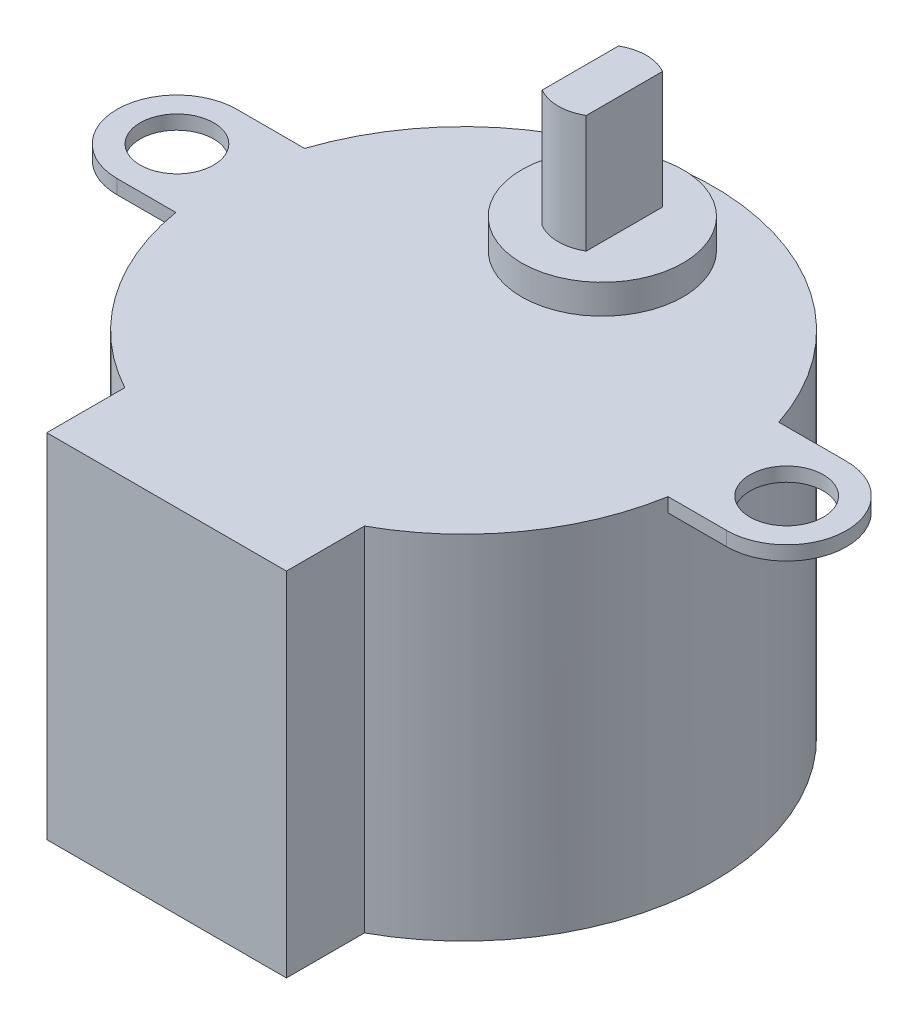
ISO-10303-21;
HEADER;
FILE_DESCRIPTION(('STEP AP214'),'2;1');
FILE_NAME('part.step','',(''),(''),'','','');
FILE_SCHEMA(('AUTOMOTIVE_DESIGN { 1 0 10303 214 1 1 1 1 }'));
ENDSEC;
DATA;
#1=APPLICATION_CONTEXT('core data for automotive mechanical design processes');
#2=APPLICATION_PROTOCOL_DEFINITION('international standard','automotive_design',2000,#1);
#3=PRODUCT_CONTEXT('',#1,'mechanical');
#4=PRODUCT('Part','Part','',(#3));
#5=PRODUCT_RELATED_PRODUCT_CATEGORY('part','',(#4));
#6=PRODUCT_DEFINITION_FORMATION('','',#4);
#7=PRODUCT_DEFINITION_CONTEXT('part definition',#1,'design');
#8=PRODUCT_DEFINITION('design','',#6,#7);
#9=PRODUCT_DEFINITION_SHAPE('','',#8);
#10=(LENGTH_UNIT() NAMED_UNIT(*) SI_UNIT(.MILLI.,.METRE.));
#11=(NAMED_UNIT(*) PLANE_ANGLE_UNIT() SI_UNIT($,.RADIAN.));
#12=(NAMED_UNIT(*) SI_UNIT($,.STERADIAN.) SOLID_ANGLE_UNIT());
#13=UNCERTAINTY_MEASURE_WITH_UNIT(LENGTH_MEASURE(1.E-05),#10,'distance_accuracy_value','');
#14=(GEOMETRIC_REPRESENTATION_CONTEXT(3) GLOBAL_UNCERTAINTY_ASSIGNED_CONTEXT((#13)) GLOBAL_UNIT_ASSIGNED_CONTEXT((#10,
#11,#12)) REPRESENTATION_CONTEXT('',''));
#15=CARTESIAN_POINT('',(0.,0.,0.));
#16=DIRECTION('',(0.,0.,1.));
#17=DIRECTION('',(1.,0.,0.));
#18=AXIS2_PLACEMENT_3D('',#15,#16,#17);
#19=CARTESIAN_POINT('',(0.,20.6375,-7.50113366733698));
#20=DIRECTION('',(0.,1.,0.));
#21=DIRECTION('',(0.,0.,1.));
#22=AXIS2_PLACEMENT_3D('',#19,#20,#21);
#23=PLANE('',#22);
#24=CARTESIAN_POINT('',(0.,20.6375,-7.50113366733698));
#25=DIRECTION('',(0.,1.,0.));
#26=DIRECTION('',(0.,0.,1.));
#27=AXIS2_PLACEMENT_3D('',#24,#25,#26);
#28=CIRCLE('',#27,4.365625);
#29=CARTESIAN_POINT('',(0.,20.6375,-3.13550866733698));
#30=VERTEX_POINT('',#29);
#31=EDGE_CURVE('E223',#30,#30,#28,.T.);
#32=ORIENTED_EDGE('',*,*,#31,.T.);
#33=EDGE_LOOP('',(#32));
#34=FACE_BOUND('',#33,.T.);
#35=CARTESIAN_POINT('',(0.,20.6375,-7.50113366733698));
#36=DIRECTION('',(0.,1.,0.));
#37=DIRECTION('',(0.,0.,1.));
#38=AXIS2_PLACEMENT_3D('',#35,#36,#37);
#39=CIRCLE('',#38,2.38125);
#40=CARTESIAN_POINT('',(1.190625,20.6375,-9.56335666009867));
#41=VERTEX_POINT('',#40);
#42=CARTESIAN_POINT('',(-1.190625,20.6375,-9.56335666009867));
#43=VERTEX_POINT('',#42);
#44=EDGE_CURVE('E205',#41,#43,#39,.T.);
#45=ORIENTED_EDGE('',*,*,#44,.F.);
#46=DIRECTION('',(0.,0.,1.));
#47=VECTOR('',#46,1.);
#48=CARTESIAN_POINT('',(1.190625,20.6375,0.));
#49=LINE('',#48,#47);
#50=CARTESIAN_POINT('',(1.190625,20.6375,-5.43891067457528));
#51=VERTEX_POINT('',#50);
#52=EDGE_CURVE('E80',#41,#51,#49,.T.);
#53=ORIENTED_EDGE('',*,*,#52,.T.);
#54=CARTESIAN_POINT('',(-1.190625,20.6375,-5.43891067457528));
#55=VERTEX_POINT('',#54);
#56=EDGE_CURVE('E85',#55,#51,#39,.T.);
#57=ORIENTED_EDGE('',*,*,#56,.F.);
#58=DIRECTION('',(0.,0.,1.));
#59=VECTOR('',#58,1.);
#60=CARTESIAN_POINT('',(-1.190625,20.6375,0.));
#61=LINE('',#60,#59);
#62=EDGE_CURVE('E203',#43,#55,#61,.T.);
#63=ORIENTED_EDGE('',*,*,#62,.F.);
#64=EDGE_LOOP('',(#45,#53,#57,#63));
#65=FACE_BOUND('',#64,.T.);
#66=ADVANCED_FACE('F62',(#34,#65),#23,.T.);
#67=CARTESIAN_POINT('',(0.,19.05,0.));
#68=DIRECTION('',(0.,-1.,0.));
#69=DIRECTION('',(0.,0.,-1.));
#70=AXIS2_PLACEMENT_3D('',#67,#68,#69);
#71=CYLINDRICAL_SURFACE('',#70,13.49375);
#72=CARTESIAN_POINT('',(0.,18.288,0.));
#73=DIRECTION('',(0.,1.,0.));
#74=DIRECTION('',(0.,0.,1.));
#75=AXIS2_PLACEMENT_3D('',#72,#73,#74);
#76=CIRCLE('',#75,13.49375);
#77=CARTESIAN_POINT('',(-12.8159928019643,18.288,-4.22275));
#78=VERTEX_POINT('',#77);
#79=CARTESIAN_POINT('',(-13.3041213915087,18.288,2.25425));
#80=VERTEX_POINT('',#79);
#81=EDGE_CURVE('E243',#78,#80,#76,.T.);
#82=ORIENTED_EDGE('',*,*,#81,.F.);
#83=DIRECTION('',(0.,1.,0.));
#84=VECTOR('',#83,1.);
#85=CARTESIAN_POINT('',(-12.8159928019643,18.288,-4.22275));
#86=LINE('',#85,#84);
#87=CARTESIAN_POINT('',(-12.8159928019643,19.05,-4.22275));
#88=VERTEX_POINT('',#87);
#89=EDGE_CURVE('E269',#78,#88,#86,.T.);
#90=ORIENTED_EDGE('',*,*,#89,.T.);
#91=CARTESIAN_POINT('',(0.,19.05,0.));
#92=DIRECTION('',(0.,1.,0.));
#93=DIRECTION('',(0.,0.,1.));
#94=AXIS2_PLACEMENT_3D('',#91,#92,#93);
#95=CIRCLE('',#94,13.49375);
#96=CARTESIAN_POINT('',(12.8159928019643,19.05,-4.22275));
#97=VERTEX_POINT('',#96);
#98=EDGE_CURVE('E355',#97,#88,#95,.T.);
#99=ORIENTED_EDGE('',*,*,#98,.F.);
#100=DIRECTION('',(0.,1.,0.));
#101=VECTOR('',#100,1.);
#102=CARTESIAN_POINT('',(12.8159928019643,18.288,-4.22275));
#103=LINE('',#102,#101);
#104=CARTESIAN_POINT('',(12.8159928019643,18.288,-4.22275));
#105=VERTEX_POINT('',#104);
#106=EDGE_CURVE('E314',#105,#97,#103,.T.);
#107=ORIENTED_EDGE('',*,*,#106,.F.);
#108=CARTESIAN_POINT('',(0.,18.288,0.));
#109=DIRECTION('',(0.,1.,0.));
#110=DIRECTION('',(0.,0.,1.));
#111=AXIS2_PLACEMENT_3D('',#108,#109,#110);
#112=CIRCLE('',#111,13.49375);
#113=CARTESIAN_POINT('',(13.3041213915087,18.288,2.25425));
#114=VERTEX_POINT('',#113);
#115=EDGE_CURVE('E294',#114,#105,#112,.T.);
#116=ORIENTED_EDGE('',*,*,#115,.F.);
#117=DIRECTION('',(0.,1.,0.));
#118=VECTOR('',#117,1.);
#119=CARTESIAN_POINT('',(13.3041213915087,18.288,2.25425));
#120=LINE('',#119,#118);
#121=CARTESIAN_POINT('',(13.3041213915087,19.05,2.25425));
#122=VERTEX_POINT('',#121);
#123=EDGE_CURVE('E256',#114,#122,#120,.T.);
#124=ORIENTED_EDGE('',*,*,#123,.T.);
#125=CARTESIAN_POINT('',(6.477,19.05,11.8376416596592));
#126=VERTEX_POINT('',#125);
#127=EDGE_CURVE('E339',#126,#122,#95,.T.);
#128=ORIENTED_EDGE('',*,*,#127,.F.);
#129=DIRECTION('',(0.,-1.,0.));
#130=VECTOR('',#129,1.);
#131=CARTESIAN_POINT('',(6.477,19.05,11.8376416596592));
#132=LINE('',#131,#130);
#133=CARTESIAN_POINT('',(6.477,0.,11.8376416596592));
#134=VERTEX_POINT('',#133);
#135=EDGE_CURVE('E334',#126,#134,#132,.T.);
#136=ORIENTED_EDGE('',*,*,#135,.T.);
#137=CARTESIAN_POINT('',(0.,0.,0.));
#138=DIRECTION('',(0.,1.,0.));
#139=DIRECTION('',(0.,0.,1.));
#140=AXIS2_PLACEMENT_3D('',#137,#138,#139);
#141=CIRCLE('',#140,13.49375);
#142=CARTESIAN_POINT('',(-6.477,0.,11.8376416596592));
#143=VERTEX_POINT('',#142);
#144=EDGE_CURVE('E66',#134,#143,#141,.T.);
#145=ORIENTED_EDGE('',*,*,#144,.T.);
#146=DIRECTION('',(0.,-1.,0.));
#147=VECTOR('',#146,1.);
#148=CARTESIAN_POINT('',(-6.477,19.05,11.8376416596592));
#149=LINE('',#148,#147);
#150=CARTESIAN_POINT('',(-6.477,19.05,11.8376416596592));
#151=VERTEX_POINT('',#150);
#152=EDGE_CURVE('E12',#151,#143,#149,.T.);
#153=ORIENTED_EDGE('',*,*,#152,.F.);
#154=CARTESIAN_POINT('',(-13.3041213915087,19.05,2.25425));
#155=VERTEX_POINT('',#154);
#156=EDGE_CURVE('E356',#155,#151,#95,.T.);
#157=ORIENTED_EDGE('',*,*,#156,.F.);
#158=DIRECTION('',(0.,1.,0.));
#159=VECTOR('',#158,1.);
#160=CARTESIAN_POINT('',(-13.3041213915087,18.288,2.25425));
#161=LINE('',#160,#159);
#162=EDGE_CURVE('E273',#80,#155,#161,.T.);
#163=ORIENTED_EDGE('',*,*,#162,.F.);
#164=EDGE_LOOP('',(#82,#90,#99,#107,#116,#124,#128,#136,#145,#153,#157,#163));
#165=FACE_BOUND('',#164,.T.);
#166=ADVANCED_FACE('F64',(#165),#71,.T.);
#167=CARTESIAN_POINT('',(-6.477,19.05,0.));
#168=DIRECTION('',(1.,0.,0.));
#169=DIRECTION('',(0.,0.,-1.));
#170=AXIS2_PLACEMENT_3D('',#167,#168,#169);
#171=PLANE('',#170);
#172=DIRECTION('',(0.,0.,1.));
#173=VECTOR('',#172,1.);
#174=CARTESIAN_POINT('',(-6.477,0.,0.));
#175=LINE('',#174,#173);
#176=CARTESIAN_POINT('',(-6.477,0.,16.0534888936574));
#177=VERTEX_POINT('',#176);
#178=EDGE_CURVE('E335',#143,#177,#175,.T.);
#179=ORIENTED_EDGE('',*,*,#178,.T.);
#180=DIRECTION('',(0.,-1.,0.));
#181=VECTOR('',#180,1.);
#182=CARTESIAN_POINT('',(-6.477,19.05,16.0534888936574));
#183=LINE('',#182,#181);
#184=CARTESIAN_POINT('',(-6.477,19.05,16.0534888936574));
#185=VERTEX_POINT('',#184);
#186=EDGE_CURVE('E72',#185,#177,#183,.T.);
#187=ORIENTED_EDGE('',*,*,#186,.F.);
#188=DIRECTION('',(0.,0.,1.));
#189=VECTOR('',#188,1.);
#190=CARTESIAN_POINT('',(-6.477,19.05,0.));
#191=LINE('',#190,#189);
#192=EDGE_CURVE('E323',#151,#185,#191,.T.);
#193=ORIENTED_EDGE('',*,*,#192,.F.);
#194=ORIENTED_EDGE('',*,*,#152,.T.);
#195=EDGE_LOOP('',(#179,#187,#193,#194));
#196=FACE_BOUND('',#195,.T.);
#197=ADVANCED_FACE('F379',(#196),#171,.F.);
#198=CARTESIAN_POINT('',(0.,19.05,16.0534888936574));
#199=DIRECTION('',(0.,0.,-1.));
#200=DIRECTION('',(-1.,0.,0.));
#201=AXIS2_PLACEMENT_3D('',#198,#199,#200);
#202=PLANE('',#201);
#203=DIRECTION('',(1.,0.,0.));
#204=VECTOR('',#203,1.);
#205=CARTESIAN_POINT('',(0.,0.,16.0534888936574));
#206=LINE('',#205,#204);
#207=CARTESIAN_POINT('',(6.477,0.,16.0534888936574));
#208=VERTEX_POINT('',#207);
#209=EDGE_CURVE('E338',#177,#208,#206,.T.);
#210=ORIENTED_EDGE('',*,*,#209,.T.);
#211=DIRECTION('',(0.,-1.,0.));
#212=VECTOR('',#211,1.);
#213=CARTESIAN_POINT('',(6.477,19.05,16.0534888936574));
#214=LINE('',#213,#212);
#215=CARTESIAN_POINT('',(6.477,19.05,16.0534888936574));
#216=VERTEX_POINT('',#215);
#217=EDGE_CURVE('E348',#216,#208,#214,.T.);
#218=ORIENTED_EDGE('',*,*,#217,.F.);
#219=DIRECTION('',(1.,0.,0.));
#220=VECTOR('',#219,1.);
#221=CARTESIAN_POINT('',(0.,19.05,16.0534888936574));
#222=LINE('',#221,#220);
#223=EDGE_CURVE('E326',#185,#216,#222,.T.);
#224=ORIENTED_EDGE('',*,*,#223,.F.);
#225=ORIENTED_EDGE('',*,*,#186,.T.);
#226=EDGE_LOOP('',(#210,#218,#224,#225));
#227=FACE_BOUND('',#226,.T.);
#228=ADVANCED_FACE('F382',(#227),#202,.F.);
#229=CARTESIAN_POINT('',(6.477,19.05,0.));
#230=DIRECTION('',(1.,0.,0.));
#231=DIRECTION('',(0.,0.,-1.));
#232=AXIS2_PLACEMENT_3D('',#229,#230,#231);
#233=PLANE('',#232);
#234=DIRECTION('',(0.,0.,1.));
#235=VECTOR('',#234,1.);
#236=CARTESIAN_POINT('',(6.477,0.,0.));
#237=LINE('',#236,#235);
#238=EDGE_CURVE('E327',#134,#208,#237,.T.);
#239=ORIENTED_EDGE('',*,*,#238,.F.);
#240=ORIENTED_EDGE('',*,*,#135,.F.);
#241=DIRECTION('',(0.,0.,1.));
#242=VECTOR('',#241,1.);
#243=CARTESIAN_POINT('',(6.477,19.05,0.));
#244=LINE('',#243,#242);
#245=EDGE_CURVE('E330',#126,#216,#244,.T.);
#246=ORIENTED_EDGE('',*,*,#245,.T.);
#247=ORIENTED_EDGE('',*,*,#217,.T.);
#248=EDGE_LOOP('',(#239,#240,#246,#247));
#249=FACE_BOUND('',#248,.T.);
#250=ADVANCED_FACE('F387',(#249),#233,.T.);
#251=CARTESIAN_POINT('',(0.,0.,0.));
#252=DIRECTION('',(0.,1.,0.));
#253=DIRECTION('',(0.,0.,1.));
#254=AXIS2_PLACEMENT_3D('',#251,#252,#253);
#255=PLANE('',#254);
#256=ORIENTED_EDGE('',*,*,#178,.F.);
#257=ORIENTED_EDGE('',*,*,#144,.F.);
#258=ORIENTED_EDGE('',*,*,#238,.T.);
#259=ORIENTED_EDGE('',*,*,#209,.F.);
#260=EDGE_LOOP('',(#256,#257,#258,#259));
#261=FACE_BOUND('',#260,.T.);
#262=ADVANCED_FACE('F376',(#261),#255,.F.);
#263=CARTESIAN_POINT('',(0.,19.05,0.));
#264=DIRECTION('',(0.,1.,0.));
#265=DIRECTION('',(0.,0.,1.));
#266=AXIS2_PLACEMENT_3D('',#263,#264,#265);
#267=PLANE('',#266);
#268=CARTESIAN_POINT('',(0.,19.05,-7.50113366733698));
#269=DIRECTION('',(0.,1.,0.));
#270=DIRECTION('',(0.,0.,1.));
#271=AXIS2_PLACEMENT_3D('',#268,#269,#270);
#272=CIRCLE('',#271,4.365625);
#273=CARTESIAN_POINT('',(0.,19.05,-3.13550866733698));
#274=VERTEX_POINT('',#273);
#275=EDGE_CURVE('E184',#274,#274,#272,.T.);
#276=ORIENTED_EDGE('',*,*,#275,.F.);
#277=EDGE_LOOP('',(#276));
#278=FACE_BOUND('',#277,.T.);
#279=ORIENTED_EDGE('',*,*,#245,.F.);
#280=ORIENTED_EDGE('',*,*,#127,.T.);
#281=DIRECTION('',(-1.,0.,0.));
#282=VECTOR('',#281,1.);
#283=CARTESIAN_POINT('',(0.,19.05,2.25425));
#284=LINE('',#283,#282);
#285=CARTESIAN_POINT('',(16.4791213915087,19.05,2.25425));
#286=VERTEX_POINT('',#285);
#287=EDGE_CURVE('E301',#286,#122,#284,.T.);
#288=ORIENTED_EDGE('',*,*,#287,.F.);
#289=CARTESIAN_POINT('',(16.4791213915087,19.05,-0.984249999999999));
#290=DIRECTION('',(0.,1.,0.));
#291=DIRECTION('',(0.,0.,1.));
#292=AXIS2_PLACEMENT_3D('',#289,#290,#291);
#293=CIRCLE('',#292,3.2385);
#294=CARTESIAN_POINT('',(16.4791213915087,19.05,-4.22275));
#295=VERTEX_POINT('',#294);
#296=EDGE_CURVE('E304',#286,#295,#293,.T.);
#297=ORIENTED_EDGE('',*,*,#296,.T.);
#298=DIRECTION('',(1.,0.,0.));
#299=VECTOR('',#298,1.);
#300=CARTESIAN_POINT('',(0.,19.05,-4.22275));
#301=LINE('',#300,#299);
#302=EDGE_CURVE('E284',#97,#295,#301,.T.);
#303=ORIENTED_EDGE('',*,*,#302,.F.);
#304=ORIENTED_EDGE('',*,*,#98,.T.);
#305=DIRECTION('',(-1.,0.,0.));
#306=VECTOR('',#305,1.);
#307=CARTESIAN_POINT('',(0.,19.05,-4.22275));
#308=LINE('',#307,#306);
#309=CARTESIAN_POINT('',(-16.4791213915087,19.05,-4.22275));
#310=VERTEX_POINT('',#309);
#311=EDGE_CURVE('E236',#88,#310,#308,.T.);
#312=ORIENTED_EDGE('',*,*,#311,.T.);
#313=CARTESIAN_POINT('',(-16.4791213915087,19.05,-0.984249999999999));
#314=DIRECTION('',(0.,1.,0.));
#315=DIRECTION('',(0.,0.,1.));
#316=AXIS2_PLACEMENT_3D('',#313,#314,#315);
#317=CIRCLE('',#316,3.2385);
#318=CARTESIAN_POINT('',(-16.4791213915087,19.05,2.25425));
#319=VERTEX_POINT('',#318);
#320=EDGE_CURVE('E255',#319,#310,#317,.F.);
#321=ORIENTED_EDGE('',*,*,#320,.F.);
#322=DIRECTION('',(1.,0.,0.));
#323=VECTOR('',#322,1.);
#324=CARTESIAN_POINT('',(0.,19.05,2.25425));
#325=LINE('',#324,#323);
#326=EDGE_CURVE('E260',#319,#155,#325,.T.);
#327=ORIENTED_EDGE('',*,*,#326,.T.);
#328=ORIENTED_EDGE('',*,*,#156,.T.);
#329=ORIENTED_EDGE('',*,*,#192,.T.);
#330=ORIENTED_EDGE('',*,*,#223,.T.);
#331=EDGE_LOOP('',(#279,#280,#288,#297,#303,#304,#312,#321,#327,#328,#329,#330));
#332=FACE_BOUND('',#331,.T.);
#333=CARTESIAN_POINT('',(16.4791213915087,19.05,-0.984249999999999));
#334=DIRECTION('',(0.,1.,0.));
#335=DIRECTION('',(0.,0.,1.));
#336=AXIS2_PLACEMENT_3D('',#333,#334,#335);
#337=CIRCLE('',#336,1.984375);
#338=CARTESIAN_POINT('',(16.4791213915087,19.05,1.000125));
#339=VERTEX_POINT('',#338);
#340=EDGE_CURVE('E227',#339,#339,#337,.F.);
#341=ORIENTED_EDGE('',*,*,#340,.T.);
#342=EDGE_LOOP('',(#341));
#343=FACE_BOUND('',#342,.T.);
#344=CARTESIAN_POINT('',(-16.4791213915087,19.05,-0.984249999999999));
#345=DIRECTION('',(0.,1.,0.));
#346=DIRECTION('',(0.,0.,1.));
#347=AXIS2_PLACEMENT_3D('',#344,#345,#346);
#348=CIRCLE('',#347,1.984375);
#349=CARTESIAN_POINT('',(-16.4791213915087,19.05,1.000125));
#350=VERTEX_POINT('',#349);
#351=EDGE_CURVE('E251',#350,#350,#348,.T.);
#352=ORIENTED_EDGE('',*,*,#351,.F.);
#353=EDGE_LOOP('',(#352));
#354=FACE_BOUND('',#353,.T.);
#355=ADVANCED_FACE('F384',(#278,#332,#343,#354),#267,.T.);
#356=CARTESIAN_POINT('',(0.,18.288,2.25425));
#357=DIRECTION('',(0.,0.,-1.));
#358=DIRECTION('',(-1.,0.,0.));
#359=AXIS2_PLACEMENT_3D('',#356,#357,#358);
#360=PLANE('',#359);
#361=ORIENTED_EDGE('',*,*,#287,.T.);
#362=ORIENTED_EDGE('',*,*,#123,.F.);
#363=DIRECTION('',(-1.,0.,0.));
#364=VECTOR('',#363,1.);
#365=CARTESIAN_POINT('',(0.,18.288,2.25425));
#366=LINE('',#365,#364);
#367=CARTESIAN_POINT('',(16.4791213915087,18.288,2.25425));
#368=VERTEX_POINT('',#367);
#369=EDGE_CURVE('E283',#368,#114,#366,.T.);
#370=ORIENTED_EDGE('',*,*,#369,.F.);
#371=DIRECTION('',(0.,1.,0.));
#372=VECTOR('',#371,1.);
#373=CARTESIAN_POINT('',(16.4791213915087,18.288,2.25425));
#374=LINE('',#373,#372);
#375=EDGE_CURVE('E297',#368,#286,#374,.T.);
#376=ORIENTED_EDGE('',*,*,#375,.T.);
#377=EDGE_LOOP('',(#361,#362,#370,#376));
#378=FACE_BOUND('',#377,.T.);
#379=ADVANCED_FACE('F393',(#378),#360,.F.);
#380=CARTESIAN_POINT('',(0.,18.288,-4.22275));
#381=DIRECTION('',(0.,0.,1.));
#382=DIRECTION('',(1.,0.,0.));
#383=AXIS2_PLACEMENT_3D('',#380,#381,#382);
#384=PLANE('',#383);
#385=ORIENTED_EDGE('',*,*,#302,.T.);
#386=DIRECTION('',(0.,1.,0.));
#387=VECTOR('',#386,1.);
#388=CARTESIAN_POINT('',(16.4791213915087,18.288,-4.22275));
#389=LINE('',#388,#387);
#390=CARTESIAN_POINT('',(16.4791213915087,18.288,-4.22275));
#391=VERTEX_POINT('',#390);
#392=EDGE_CURVE('E318',#391,#295,#389,.T.);
#393=ORIENTED_EDGE('',*,*,#392,.F.);
#394=DIRECTION('',(1.,0.,0.));
#395=VECTOR('',#394,1.);
#396=CARTESIAN_POINT('',(0.,18.288,-4.22275));
#397=LINE('',#396,#395);
#398=EDGE_CURVE('E291',#105,#391,#397,.T.);
#399=ORIENTED_EDGE('',*,*,#398,.F.);
#400=ORIENTED_EDGE('',*,*,#106,.T.);
#401=EDGE_LOOP('',(#385,#393,#399,#400));
#402=FACE_BOUND('',#401,.T.);
#403=ADVANCED_FACE('F401',(#402),#384,.F.);
#404=CARTESIAN_POINT('',(16.4791213915087,18.288,-0.984249999999999));
#405=DIRECTION('',(0.,1.,0.));
#406=DIRECTION('',(0.,0.,1.));
#407=AXIS2_PLACEMENT_3D('',#404,#405,#406);
#408=CYLINDRICAL_SURFACE('',#407,1.984375);
#409=CARTESIAN_POINT('',(16.4791213915087,18.288,-0.984249999999999));
#410=DIRECTION('',(0.,1.,0.));
#411=DIRECTION('',(0.,0.,1.));
#412=AXIS2_PLACEMENT_3D('',#409,#410,#411);
#413=CIRCLE('',#412,1.984375);
#414=CARTESIAN_POINT('',(16.4791213915087,18.288,1.000125));
#415=VERTEX_POINT('',#414);
#416=EDGE_CURVE('E279',#415,#415,#413,.F.);
#417=CARTESIAN_POINT('',(16.4791213915087,18.288,1.000125));
#418=CARTESIAN_POINT('',(16.4791213915087,18.2959375,1.000125));
#419=CARTESIAN_POINT('',(16.4791213915087,18.303875,1.000125));
#420=CARTESIAN_POINT('',(16.4791213915087,18.31975,1.000125));
#421=CARTESIAN_POINT('',(16.4791213915087,18.3276875,1.000125));
#422=CARTESIAN_POINT('',(16.4791213915087,18.3435625,1.000125));
#423=CARTESIAN_POINT('',(16.4791213915087,18.3515,1.000125));
#424=CARTESIAN_POINT('',(16.4791213915087,18.367375,1.000125));
#425=CARTESIAN_POINT('',(16.4791213915087,18.3753125,1.000125));
#426=CARTESIAN_POINT('',(16.4791213915087,18.3911875,1.000125));
#427=CARTESIAN_POINT('',(16.4791213915087,18.399125,1.000125));
#428=CARTESIAN_POINT('',(16.4791213915087,18.415,1.000125));
#429=CARTESIAN_POINT('',(16.4791213915087,18.4229375,1.000125));
#430=CARTESIAN_POINT('',(16.4791213915087,18.4388125,1.000125));
#431=CARTESIAN_POINT('',(16.4791213915087,18.44675,1.000125));
#432=CARTESIAN_POINT('',(16.4791213915087,18.462625,1.000125));
#433=CARTESIAN_POINT('',(16.4791213915087,18.4705625,1.000125));
#434=CARTESIAN_POINT('',(16.4791213915087,18.4864375,1.000125));
#435=CARTESIAN_POINT('',(16.4791213915087,18.494375,1.000125));
#436=CARTESIAN_POINT('',(16.4791213915087,18.51025,1.000125));
#437=CARTESIAN_POINT('',(16.4791213915087,18.5181875,1.000125));
#438=CARTESIAN_POINT('',(16.4791213915087,18.5340625,1.000125));
#439=CARTESIAN_POINT('',(16.4791213915087,18.542,1.000125));
#440=CARTESIAN_POINT('',(16.4791213915087,18.557875,1.000125));
#441=CARTESIAN_POINT('',(16.4791213915087,18.5658125,1.000125));
#442=CARTESIAN_POINT('',(16.4791213915087,18.5816875,1.000125));
#443=CARTESIAN_POINT('',(16.4791213915087,18.589625,1.000125));
#444=CARTESIAN_POINT('',(16.4791213915087,18.6055,1.000125));
#445=CARTESIAN_POINT('',(16.4791213915087,18.6134375,1.000125));
#446=CARTESIAN_POINT('',(16.4791213915087,18.6293125,1.000125));
#447=CARTESIAN_POINT('',(16.4791213915087,18.63725,1.000125));
#448=CARTESIAN_POINT('',(16.4791213915087,18.653125,1.000125));
#449=CARTESIAN_POINT('',(16.4791213915087,18.6610625,1.000125));
#450=CARTESIAN_POINT('',(16.4791213915087,18.6769375,1.000125));
#451=CARTESIAN_POINT('',(16.4791213915087,18.684875,1.000125));
#452=CARTESIAN_POINT('',(16.4791213915087,18.70075,1.000125));
#453=CARTESIAN_POINT('',(16.4791213915087,18.7086875,1.000125));
#454=CARTESIAN_POINT('',(16.4791213915087,18.7245625,1.000125));
#455=CARTESIAN_POINT('',(16.4791213915087,18.7325,1.000125));
#456=CARTESIAN_POINT('',(16.4791213915087,18.748375,1.000125));
#457=CARTESIAN_POINT('',(16.4791213915087,18.7563125,1.000125));
#458=CARTESIAN_POINT('',(16.4791213915087,18.7721875,1.000125));
#459=CARTESIAN_POINT('',(16.4791213915087,18.780125,1.000125));
#460=CARTESIAN_POINT('',(16.4791213915087,18.796,1.000125));
#461=CARTESIAN_POINT('',(16.4791213915087,18.8039375,1.000125));
#462=CARTESIAN_POINT('',(16.4791213915087,18.8198125,1.000125));
#463=CARTESIAN_POINT('',(16.4791213915087,18.82775,1.000125));
#464=CARTESIAN_POINT('',(16.4791213915087,18.843625,1.000125));
#465=CARTESIAN_POINT('',(16.4791213915087,18.8515625,1.000125));
#466=CARTESIAN_POINT('',(16.4791213915087,18.8674375,1.000125));
#467=CARTESIAN_POINT('',(16.4791213915087,18.875375,1.000125));
#468=CARTESIAN_POINT('',(16.4791213915087,18.89125,1.000125));
#469=CARTESIAN_POINT('',(16.4791213915087,18.8991875,1.000125));
#470=CARTESIAN_POINT('',(16.4791213915087,18.9150625,1.000125));
#471=CARTESIAN_POINT('',(16.4791213915087,18.923,1.000125));
#472=CARTESIAN_POINT('',(16.4791213915087,18.938875,1.000125));
#473=CARTESIAN_POINT('',(16.4791213915087,18.9468125,1.000125));
#474=CARTESIAN_POINT('',(16.4791213915087,18.9626875,1.000125));
#475=CARTESIAN_POINT('',(16.4791213915087,18.970625,1.000125));
#476=CARTESIAN_POINT('',(16.4791213915087,18.9865,1.000125));
#477=CARTESIAN_POINT('',(16.4791213915087,18.9944375,1.000125));
#478=CARTESIAN_POINT('',(16.4791213915087,19.0103125,1.000125));
#479=CARTESIAN_POINT('',(16.4791213915087,19.01825,1.000125));
#480=CARTESIAN_POINT('',(16.4791213915087,19.034125,1.000125));
#481=CARTESIAN_POINT('',(16.4791213915087,19.0420625,1.000125));
#482=CARTESIAN_POINT('',(16.4791213915087,19.05,1.000125));
#483=B_SPLINE_CURVE_WITH_KNOTS('',3,(#417,#418,#419,#420,#421,#422,#423,#424,#425,#426,#427,
#428,#429,#430,#431,#432,#433,#434,#435,#436,#437,#438,#439,#440,#441,#442,#443,#444,#445,#446,
#447,#448,#449,#450,#451,#452,#453,#454,#455,#456,#457,#458,#459,#460,#461,#462,#463,#464,#465,
#466,#467,#468,#469,#470,#471,#472,#473,#474,#475,#476,#477,#478,#479,#480,#481,#482),
.UNSPECIFIED.,.F.,.F.,(4,2,2,2,2,2,2,2,2,2,2,2,2,2,2,2,2,2,2,2,2,2,2,2,2,2,2,2,2,2,2,2,4),(0.,
0.0238124999999978,0.0476249999999991,0.0714374999999969,0.0952499999999981,0.119062499999999,
0.142874999999997,0.166687499999998,0.1905,0.214312499999997,0.238124999999999,
0.261937499999997,0.285749999999998,0.309562499999999,0.333374999999997,0.357187499999998,
0.380999999999999,0.404812499999997,0.428624999999998,0.452437499999996,0.476249999999998,
0.500062499999999,0.523874999999997,0.547687499999998,0.571499999999999,0.595312499999997,
0.619124999999998,0.642937499999996,0.666749999999997,0.690562499999998,0.714374999999996,
0.738187499999998,0.761999999999999),.UNSPECIFIED.);
#484=EDGE_CURVE('BSEAM457',#415,#339,#483,.T.);
#485=ORIENTED_EDGE('',*,*,#416,.T.);
#486=ORIENTED_EDGE('',*,*,#340,.F.);
#487=ORIENTED_EDGE('',*,*,#484,.T.);
#488=ORIENTED_EDGE('',*,*,#484,.F.);
#489=EDGE_LOOP('',(#485,#487,#486,#488));
#490=FACE_BOUND('',#489,.T.);
#491=ADVANCED_FACE('F457',(#490),#408,.F.);
#492=CARTESIAN_POINT('',(16.4791213915087,18.288,-0.984249999999999));
#493=DIRECTION('',(0.,1.,0.));
#494=DIRECTION('',(0.,0.,1.));
#495=AXIS2_PLACEMENT_3D('',#492,#493,#494);
#496=CYLINDRICAL_SURFACE('',#495,3.2385);
#497=ORIENTED_EDGE('',*,*,#296,.F.);
#498=ORIENTED_EDGE('',*,*,#375,.F.);
#499=CARTESIAN_POINT('',(16.4791213915087,18.288,-0.984249999999999));
#500=DIRECTION('',(0.,1.,0.));
#501=DIRECTION('',(0.,0.,1.));
#502=AXIS2_PLACEMENT_3D('',#499,#500,#501);
#503=CIRCLE('',#502,3.2385);
#504=EDGE_CURVE('E287',#368,#391,#503,.T.);
#505=ORIENTED_EDGE('',*,*,#504,.T.);
#506=ORIENTED_EDGE('',*,*,#392,.T.);
#507=EDGE_LOOP('',(#497,#498,#505,#506));
#508=FACE_BOUND('',#507,.T.);
#509=ADVANCED_FACE('F397',(#508),#496,.T.);
#510=CARTESIAN_POINT('',(0.,18.288,0.));
#511=DIRECTION('',(0.,1.,0.));
#512=DIRECTION('',(0.,0.,1.));
#513=AXIS2_PLACEMENT_3D('',#510,#511,#512);
#514=PLANE('',#513);
#515=ORIENTED_EDGE('',*,*,#416,.F.);
#516=EDGE_LOOP('',(#515));
#517=FACE_BOUND('',#516,.T.);
#518=ORIENTED_EDGE('',*,*,#369,.T.);
#519=ORIENTED_EDGE('',*,*,#115,.T.);
#520=ORIENTED_EDGE('',*,*,#398,.T.);
#521=ORIENTED_EDGE('',*,*,#504,.F.);
#522=EDGE_LOOP('',(#518,#519,#520,#521));
#523=FACE_BOUND('',#522,.T.);
#524=ADVANCED_FACE('F448',(#517,#523),#514,.F.);
#525=CARTESIAN_POINT('',(-16.4791213915087,18.288,-0.984249999999999));
#526=DIRECTION('',(0.,1.,0.));
#527=DIRECTION('',(0.,0.,1.));
#528=AXIS2_PLACEMENT_3D('',#525,#526,#527);
#529=CYLINDRICAL_SURFACE('',#528,3.2385);
#530=ORIENTED_EDGE('',*,*,#320,.T.);
#531=DIRECTION('',(0.,1.,0.));
#532=VECTOR('',#531,1.);
#533=CARTESIAN_POINT('',(-16.4791213915087,18.288,-4.22275));
#534=LINE('',#533,#532);
#535=CARTESIAN_POINT('',(-16.4791213915087,18.288,-4.22275));
#536=VERTEX_POINT('',#535);
#537=EDGE_CURVE('E266',#536,#310,#534,.T.);
#538=ORIENTED_EDGE('',*,*,#537,.F.);
#539=CARTESIAN_POINT('',(-16.4791213915087,18.288,-0.984249999999999));
#540=DIRECTION('',(0.,1.,0.));
#541=DIRECTION('',(0.,0.,1.));
#542=AXIS2_PLACEMENT_3D('',#539,#540,#541);
#543=CIRCLE('',#542,3.2385);
#544=CARTESIAN_POINT('',(-16.4791213915087,18.288,2.25425));
#545=VERTEX_POINT('',#544);
#546=EDGE_CURVE('E235',#545,#536,#543,.F.);
#547=ORIENTED_EDGE('',*,*,#546,.F.);
#548=DIRECTION('',(0.,1.,0.));
#549=VECTOR('',#548,1.);
#550=CARTESIAN_POINT('',(-16.4791213915087,18.288,2.25425));
#551=LINE('',#550,#549);
#552=EDGE_CURVE('E250',#545,#319,#551,.T.);
#553=ORIENTED_EDGE('',*,*,#552,.T.);
#554=EDGE_LOOP('',(#530,#538,#547,#553));
#555=FACE_BOUND('',#554,.T.);
#556=ADVANCED_FACE('F414',(#555),#529,.T.);
#557=CARTESIAN_POINT('',(0.,18.288,-4.22275));
#558=DIRECTION('',(0.,0.,-1.));
#559=DIRECTION('',(-1.,0.,0.));
#560=AXIS2_PLACEMENT_3D('',#557,#558,#559);
#561=PLANE('',#560);
#562=ORIENTED_EDGE('',*,*,#311,.F.);
#563=ORIENTED_EDGE('',*,*,#89,.F.);
#564=DIRECTION('',(-1.,0.,0.));
#565=VECTOR('',#564,1.);
#566=CARTESIAN_POINT('',(0.,18.288,-4.22275));
#567=LINE('',#566,#565);
#568=EDGE_CURVE('E246',#78,#536,#567,.T.);
#569=ORIENTED_EDGE('',*,*,#568,.T.);
#570=ORIENTED_EDGE('',*,*,#537,.T.);
#571=EDGE_LOOP('',(#562,#563,#569,#570));
#572=FACE_BOUND('',#571,.T.);
#573=ADVANCED_FACE('F407',(#572),#561,.T.);
#574=CARTESIAN_POINT('',(-16.4791213915087,18.288,-0.984249999999999));
#575=DIRECTION('',(0.,1.,0.));
#576=DIRECTION('',(0.,0.,1.));
#577=AXIS2_PLACEMENT_3D('',#574,#575,#576);
#578=CYLINDRICAL_SURFACE('',#577,1.984375);
#579=CARTESIAN_POINT('',(-16.4791213915087,18.288,-0.984249999999999));
#580=DIRECTION('',(0.,1.,0.));
#581=DIRECTION('',(0.,0.,1.));
#582=AXIS2_PLACEMENT_3D('',#579,#580,#581);
#583=CIRCLE('',#582,1.984375);
#584=CARTESIAN_POINT('',(-16.4791213915087,18.288,1.000125));
#585=VERTEX_POINT('',#584);
#586=EDGE_CURVE('E231',#585,#585,#583,.T.);
#587=CARTESIAN_POINT('',(-16.4791213915087,18.288,1.000125));
#588=CARTESIAN_POINT('',(-16.4791213915087,18.2959375,1.000125));
#589=CARTESIAN_POINT('',(-16.4791213915087,18.303875,1.000125));
#590=CARTESIAN_POINT('',(-16.4791213915087,18.31975,1.000125));
#591=CARTESIAN_POINT('',(-16.4791213915087,18.3276875,1.000125));
#592=CARTESIAN_POINT('',(-16.4791213915087,18.3435625,1.000125));
#593=CARTESIAN_POINT('',(-16.4791213915087,18.3515,1.000125));
#594=CARTESIAN_POINT('',(-16.4791213915087,18.367375,1.000125));
#595=CARTESIAN_POINT('',(-16.4791213915087,18.3753125,1.000125));
#596=CARTESIAN_POINT('',(-16.4791213915087,18.3911875,1.000125));
#597=CARTESIAN_POINT('',(-16.4791213915087,18.399125,1.000125));
#598=CARTESIAN_POINT('',(-16.4791213915087,18.415,1.000125));
#599=CARTESIAN_POINT('',(-16.4791213915087,18.4229375,1.000125));
#600=CARTESIAN_POINT('',(-16.4791213915087,18.4388125,1.000125));
#601=CARTESIAN_POINT('',(-16.4791213915087,18.44675,1.000125));
#602=CARTESIAN_POINT('',(-16.4791213915087,18.462625,1.000125));
#603=CARTESIAN_POINT('',(-16.4791213915087,18.4705625,1.000125));
#604=CARTESIAN_POINT('',(-16.4791213915087,18.4864375,1.000125));
#605=CARTESIAN_POINT('',(-16.4791213915087,18.494375,1.000125));
#606=CARTESIAN_POINT('',(-16.4791213915087,18.51025,1.000125));
#607=CARTESIAN_POINT('',(-16.4791213915087,18.5181875,1.000125));
#608=CARTESIAN_POINT('',(-16.4791213915087,18.5340625,1.000125));
#609=CARTESIAN_POINT('',(-16.4791213915087,18.542,1.000125));
#610=CARTESIAN_POINT('',(-16.4791213915087,18.557875,1.000125));
#611=CARTESIAN_POINT('',(-16.4791213915087,18.5658125,1.000125));
#612=CARTESIAN_POINT('',(-16.4791213915087,18.5816875,1.000125));
#613=CARTESIAN_POINT('',(-16.4791213915087,18.589625,1.000125));
#614=CARTESIAN_POINT('',(-16.4791213915087,18.6055,1.000125));
#615=CARTESIAN_POINT('',(-16.4791213915087,18.6134375,1.000125));
#616=CARTESIAN_POINT('',(-16.4791213915087,18.6293125,1.000125));
#617=CARTESIAN_POINT('',(-16.4791213915087,18.63725,1.000125));
#618=CARTESIAN_POINT('',(-16.4791213915087,18.653125,1.000125));
#619=CARTESIAN_POINT('',(-16.4791213915087,18.6610625,1.000125));
#620=CARTESIAN_POINT('',(-16.4791213915087,18.6769375,1.000125));
#621=CARTESIAN_POINT('',(-16.4791213915087,18.684875,1.000125));
#622=CARTESIAN_POINT('',(-16.4791213915087,18.70075,1.000125));
#623=CARTESIAN_POINT('',(-16.4791213915087,18.7086875,1.000125));
#624=CARTESIAN_POINT('',(-16.4791213915087,18.7245625,1.000125));
#625=CARTESIAN_POINT('',(-16.4791213915087,18.7325,1.000125));
#626=CARTESIAN_POINT('',(-16.4791213915087,18.748375,1.000125));
#627=CARTESIAN_POINT('',(-16.4791213915087,18.7563125,1.000125));
#628=CARTESIAN_POINT('',(-16.4791213915087,18.7721875,1.000125));
#629=CARTESIAN_POINT('',(-16.4791213915087,18.780125,1.000125));
#630=CARTESIAN_POINT('',(-16.4791213915087,18.796,1.000125));
#631=CARTESIAN_POINT('',(-16.4791213915087,18.8039375,1.000125));
#632=CARTESIAN_POINT('',(-16.4791213915087,18.8198125,1.000125));
#633=CARTESIAN_POINT('',(-16.4791213915087,18.82775,1.000125));
#634=CARTESIAN_POINT('',(-16.4791213915087,18.843625,1.000125));
#635=CARTESIAN_POINT('',(-16.4791213915087,18.8515625,1.000125));
#636=CARTESIAN_POINT('',(-16.4791213915087,18.8674375,1.000125));
#637=CARTESIAN_POINT('',(-16.4791213915087,18.875375,1.000125));
#638=CARTESIAN_POINT('',(-16.4791213915087,18.89125,1.000125));
#639=CARTESIAN_POINT('',(-16.4791213915087,18.8991875,1.000125));
#640=CARTESIAN_POINT('',(-16.4791213915087,18.9150625,1.000125));
#641=CARTESIAN_POINT('',(-16.4791213915087,18.923,1.000125));
#642=CARTESIAN_POINT('',(-16.4791213915087,18.938875,1.000125));
#643=CARTESIAN_POINT('',(-16.4791213915087,18.9468125,1.000125));
#644=CARTESIAN_POINT('',(-16.4791213915087,18.9626875,1.000125));
#645=CARTESIAN_POINT('',(-16.4791213915087,18.970625,1.000125));
#646=CARTESIAN_POINT('',(-16.4791213915087,18.9865,1.000125));
#647=CARTESIAN_POINT('',(-16.4791213915087,18.9944375,1.000125));
#648=CARTESIAN_POINT('',(-16.4791213915087,19.0103125,1.000125));
#649=CARTESIAN_POINT('',(-16.4791213915087,19.01825,1.000125));
#650=CARTESIAN_POINT('',(-16.4791213915087,19.034125,1.000125));
#651=CARTESIAN_POINT('',(-16.4791213915087,19.0420625,1.000125));
#652=CARTESIAN_POINT('',(-16.4791213915087,19.05,1.000125));
#653=B_SPLINE_CURVE_WITH_KNOTS('',3,(#587,#588,#589,#590,#591,#592,#593,#594,#595,#596,#597,
#598,#599,#600,#601,#602,#603,#604,#605,#606,#607,#608,#609,#610,#611,#612,#613,#614,#615,#616,
#617,#618,#619,#620,#621,#622,#623,#624,#625,#626,#627,#628,#629,#630,#631,#632,#633,#634,#635,
#636,#637,#638,#639,#640,#641,#642,#643,#644,#645,#646,#647,#648,#649,#650,#651,#652),
.UNSPECIFIED.,.F.,.F.,(4,2,2,2,2,2,2,2,2,2,2,2,2,2,2,2,2,2,2,2,2,2,2,2,2,2,2,2,2,2,2,2,4),(0.,
0.0238124999999978,0.0476249999999991,0.0714374999999969,0.0952499999999981,0.119062499999999,
0.142874999999997,0.166687499999998,0.1905,0.214312499999997,0.238124999999999,
0.261937499999997,0.285749999999998,0.309562499999999,0.333374999999997,0.357187499999998,
0.380999999999999,0.404812499999997,0.428624999999998,0.452437499999996,0.476249999999998,
0.500062499999999,0.523874999999997,0.547687499999998,0.571499999999999,0.595312499999997,
0.619124999999998,0.642937499999996,0.666749999999997,0.690562499999998,0.714374999999996,
0.738187499999998,0.761999999999999),.UNSPECIFIED.);
#654=EDGE_CURVE('BSEAM419',#585,#350,#653,.T.);
#655=ORIENTED_EDGE('',*,*,#586,.F.);
#656=ORIENTED_EDGE('',*,*,#351,.T.);
#657=ORIENTED_EDGE('',*,*,#654,.T.);
#658=ORIENTED_EDGE('',*,*,#654,.F.);
#659=EDGE_LOOP('',(#655,#657,#656,#658));
#660=FACE_BOUND('',#659,.T.);
#661=ADVANCED_FACE('F419',(#660),#578,.F.);
#662=CARTESIAN_POINT('',(0.,18.288,2.25425));
#663=DIRECTION('',(0.,0.,1.));
#664=DIRECTION('',(1.,0.,0.));
#665=AXIS2_PLACEMENT_3D('',#662,#663,#664);
#666=PLANE('',#665);
#667=ORIENTED_EDGE('',*,*,#326,.F.);
#668=ORIENTED_EDGE('',*,*,#552,.F.);
#669=DIRECTION('',(1.,0.,0.));
#670=VECTOR('',#669,1.);
#671=CARTESIAN_POINT('',(0.,18.288,2.25425));
#672=LINE('',#671,#670);
#673=EDGE_CURVE('E239',#545,#80,#672,.T.);
#674=ORIENTED_EDGE('',*,*,#673,.T.);
#675=ORIENTED_EDGE('',*,*,#162,.T.);
#676=EDGE_LOOP('',(#667,#668,#674,#675));
#677=FACE_BOUND('',#676,.T.);
#678=ADVANCED_FACE('F417',(#677),#666,.T.);
#679=CARTESIAN_POINT('',(0.,18.288,0.));
#680=DIRECTION('',(0.,1.,0.));
#681=DIRECTION('',(0.,0.,1.));
#682=AXIS2_PLACEMENT_3D('',#679,#680,#681);
#683=PLANE('',#682);
#684=ORIENTED_EDGE('',*,*,#586,.T.);
#685=EDGE_LOOP('',(#684));
#686=FACE_BOUND('',#685,.T.);
#687=ORIENTED_EDGE('',*,*,#546,.T.);
#688=ORIENTED_EDGE('',*,*,#568,.F.);
#689=ORIENTED_EDGE('',*,*,#81,.T.);
#690=ORIENTED_EDGE('',*,*,#673,.F.);
#691=EDGE_LOOP('',(#687,#688,#689,#690));
#692=FACE_BOUND('',#691,.T.);
#693=ADVANCED_FACE('F409',(#686,#692),#683,.F.);
#694=CARTESIAN_POINT('',(0.,20.6375,-7.50113366733698));
#695=DIRECTION('',(0.,-1.,0.));
#696=DIRECTION('',(0.,0.,-1.));
#697=AXIS2_PLACEMENT_3D('',#694,#695,#696);
#698=CYLINDRICAL_SURFACE('',#697,4.365625);
#699=ORIENTED_EDGE('',*,*,#31,.F.);
#700=EDGE_LOOP('',(#699));
#701=FACE_BOUND('',#700,.T.);
#702=ORIENTED_EDGE('',*,*,#275,.T.);
#703=EDGE_LOOP('',(#702));
#704=FACE_BOUND('',#703,.T.);
#705=ADVANCED_FACE('F425',(#701,#704),#698,.T.);
#706=CARTESIAN_POINT('',(1.190625,26.9875,0.));
#707=DIRECTION('',(1.,0.,0.));
#708=DIRECTION('',(0.,0.,-1.));
#709=AXIS2_PLACEMENT_3D('',#706,#707,#708);
#710=PLANE('',#709);
#711=ORIENTED_EDGE('',*,*,#52,.F.);
#712=DIRECTION('',(0.,-1.,0.));
#713=VECTOR('',#712,1.);
#714=CARTESIAN_POINT('',(1.190625,26.9875,-9.56335666009867));
#715=LINE('',#714,#713);
#716=CARTESIAN_POINT('',(1.190625,26.9875,-9.56335666009867));
#717=VERTEX_POINT('',#716);
#718=EDGE_CURVE('E176',#717,#41,#715,.T.);
#719=ORIENTED_EDGE('',*,*,#718,.F.);
#720=DIRECTION('',(0.,0.,1.));
#721=VECTOR('',#720,1.);
#722=CARTESIAN_POINT('',(1.190625,26.9875,0.));
#723=LINE('',#722,#721);
#724=CARTESIAN_POINT('',(1.190625,26.9875,-5.43891067457528));
#725=VERTEX_POINT('',#724);
#726=EDGE_CURVE('E180',#717,#725,#723,.T.);
#727=ORIENTED_EDGE('',*,*,#726,.T.);
#728=DIRECTION('',(0.,-1.,0.));
#729=VECTOR('',#728,1.);
#730=CARTESIAN_POINT('',(1.190625,26.9875,-5.43891067457528));
#731=LINE('',#730,#729);
#732=EDGE_CURVE('E214',#725,#51,#731,.T.);
#733=ORIENTED_EDGE('',*,*,#732,.T.);
#734=EDGE_LOOP('',(#711,#719,#727,#733));
#735=FACE_BOUND('',#734,.T.);
#736=ADVANCED_FACE('F178',(#735),#710,.T.);
#737=CARTESIAN_POINT('',(0.,26.9875,-7.50113366733698));
#738=DIRECTION('',(0.,-1.,0.));
#739=DIRECTION('',(0.,0.,-1.));
#740=AXIS2_PLACEMENT_3D('',#737,#738,#739);
#741=CYLINDRICAL_SURFACE('',#740,2.38125);
#742=ORIENTED_EDGE('',*,*,#44,.T.);
#743=DIRECTION('',(0.,-1.,0.));
#744=VECTOR('',#743,1.);
#745=CARTESIAN_POINT('',(-1.190625,26.9875,-9.56335666009867));
#746=LINE('',#745,#744);
#747=CARTESIAN_POINT('',(-1.190625,26.9875,-9.56335666009867));
#748=VERTEX_POINT('',#747);
#749=EDGE_CURVE('E185',#748,#43,#746,.T.);
#750=ORIENTED_EDGE('',*,*,#749,.F.);
#751=CARTESIAN_POINT('',(0.,26.9875,-7.50113366733698));
#752=DIRECTION('',(0.,1.,0.));
#753=DIRECTION('',(0.,0.,1.));
#754=AXIS2_PLACEMENT_3D('',#751,#752,#753);
#755=CIRCLE('',#754,2.38125);
#756=EDGE_CURVE('E188',#717,#748,#755,.T.);
#757=ORIENTED_EDGE('',*,*,#756,.F.);
#758=ORIENTED_EDGE('',*,*,#718,.T.);
#759=EDGE_LOOP('',(#742,#750,#757,#758));
#760=FACE_BOUND('',#759,.T.);
#761=ADVANCED_FACE('F189',(#760),#741,.T.);
#762=CARTESIAN_POINT('',(-1.190625,26.9875,0.));
#763=DIRECTION('',(1.,0.,0.));
#764=DIRECTION('',(0.,0.,-1.));
#765=AXIS2_PLACEMENT_3D('',#762,#763,#764);
#766=PLANE('',#765);
#767=ORIENTED_EDGE('',*,*,#62,.T.);
#768=DIRECTION('',(0.,-1.,0.));
#769=VECTOR('',#768,1.);
#770=CARTESIAN_POINT('',(-1.190625,26.9875,-5.43891067457528));
#771=LINE('',#770,#769);
#772=CARTESIAN_POINT('',(-1.190625,26.9875,-5.43891067457528));
#773=VERTEX_POINT('',#772);
#774=EDGE_CURVE('E217',#773,#55,#771,.T.);
#775=ORIENTED_EDGE('',*,*,#774,.F.);
#776=DIRECTION('',(0.,0.,1.));
#777=VECTOR('',#776,1.);
#778=CARTESIAN_POINT('',(-1.190625,26.9875,0.));
#779=LINE('',#778,#777);
#780=EDGE_CURVE('E194',#748,#773,#779,.T.);
#781=ORIENTED_EDGE('',*,*,#780,.F.);
#782=ORIENTED_EDGE('',*,*,#749,.T.);
#783=EDGE_LOOP('',(#767,#775,#781,#782));
#784=FACE_BOUND('',#783,.T.);
#785=ADVANCED_FACE('F573',(#784),#766,.F.);
#786=ORIENTED_EDGE('',*,*,#56,.T.);
#787=ORIENTED_EDGE('',*,*,#732,.F.);
#788=EDGE_CURVE('E196',#773,#725,#755,.T.);
#789=ORIENTED_EDGE('',*,*,#788,.F.);
#790=ORIENTED_EDGE('',*,*,#774,.T.);
#791=EDGE_LOOP('',(#786,#787,#789,#790));
#792=FACE_BOUND('',#791,.T.);
#793=ADVANCED_FACE('F575',(#792),#741,.T.);
#794=CARTESIAN_POINT('',(0.,26.9875,0.));
#795=DIRECTION('',(0.,1.,0.));
#796=DIRECTION('',(0.,0.,1.));
#797=AXIS2_PLACEMENT_3D('',#794,#795,#796);
#798=PLANE('',#797);
#799=ORIENTED_EDGE('',*,*,#726,.F.);
#800=ORIENTED_EDGE('',*,*,#756,.T.);
#801=ORIENTED_EDGE('',*,*,#780,.T.);
#802=ORIENTED_EDGE('',*,*,#788,.T.);
#803=EDGE_LOOP('',(#799,#800,#801,#802));
#804=FACE_BOUND('',#803,.T.);
#805=ADVANCED_FACE('F197',(#804),#798,.T.);
#806=CLOSED_SHELL('',(#66,#166,#197,#228,#250,#262,#355,#379,#403,#491,#509,#524,#556,#573,#661,
#678,#693,#705,#736,#761,#785,#793,#805));
#807=MANIFOLD_SOLID_BREP('B2',#806);
#808=ADVANCED_BREP_SHAPE_REPRESENTATION('',(#18,#807),#14);
#809=SHAPE_DEFINITION_REPRESENTATION(#9,#808);
ENDSEC;
END-ISO-10303-21;
